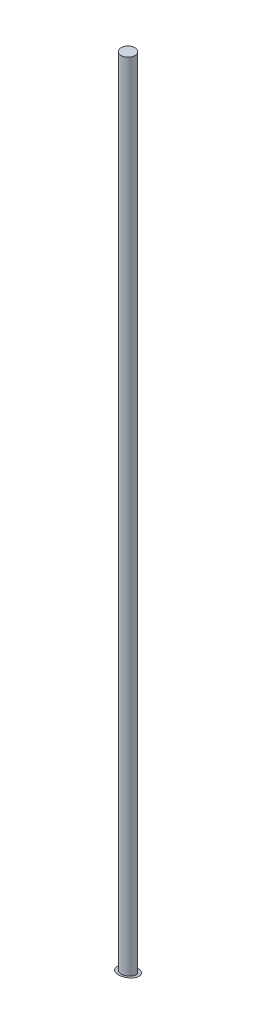
ISO-10303-21;
HEADER;
FILE_DESCRIPTION(('STEP AP214'),'2;1');
FILE_NAME('part.step','',(''),(''),'','','');
FILE_SCHEMA(('AUTOMOTIVE_DESIGN { 1 0 10303 214 1 1 1 1 }'));
ENDSEC;
DATA;
#1=APPLICATION_CONTEXT('core data for automotive mechanical design processes');
#2=APPLICATION_PROTOCOL_DEFINITION('international standard','automotive_design',2000,#1);
#3=PRODUCT_CONTEXT('',#1,'mechanical');
#4=PRODUCT('Part','Part','',(#3));
#5=PRODUCT_RELATED_PRODUCT_CATEGORY('part','',(#4));
#6=PRODUCT_DEFINITION_FORMATION('','',#4);
#7=PRODUCT_DEFINITION_CONTEXT('part definition',#1,'design');
#8=PRODUCT_DEFINITION('design','',#6,#7);
#9=PRODUCT_DEFINITION_SHAPE('','',#8);
#10=(LENGTH_UNIT() NAMED_UNIT(*) SI_UNIT(.MILLI.,.METRE.));
#11=(NAMED_UNIT(*) PLANE_ANGLE_UNIT() SI_UNIT($,.RADIAN.));
#12=(NAMED_UNIT(*) SI_UNIT($,.STERADIAN.) SOLID_ANGLE_UNIT());
#13=UNCERTAINTY_MEASURE_WITH_UNIT(LENGTH_MEASURE(1.E-05),#10,'distance_accuracy_value','');
#14=(GEOMETRIC_REPRESENTATION_CONTEXT(3) GLOBAL_UNCERTAINTY_ASSIGNED_CONTEXT((#13)) GLOBAL_UNIT_ASSIGNED_CONTEXT((#10,
#11,#12)) REPRESENTATION_CONTEXT('',''));
#15=CARTESIAN_POINT('',(0.,0.,0.));
#16=DIRECTION('',(0.,0.,1.));
#17=DIRECTION('',(1.,0.,0.));
#18=AXIS2_PLACEMENT_3D('',#15,#16,#17);
#19=CARTESIAN_POINT('',(0.,145.,0.));
#20=DIRECTION('',(0.,-1.,0.));
#21=DIRECTION('',(0.,0.,-1.));
#22=AXIS2_PLACEMENT_3D('',#19,#20,#21);
#23=CYLINDRICAL_SURFACE('',#22,1.25);
#24=CARTESIAN_POINT('',(0.,0.225135735292148,0.));
#25=DIRECTION('',(0.,-0.984164685861508,0.177256512159977));
#26=DIRECTION('',(0.,-0.177256512159977,-0.984164685861508));
#27=AXIS2_PLACEMENT_3D('',#24,#25,#26);
#28=ELLIPSE('',#27,1.27011263252734,1.25);
#29=CARTESIAN_POINT('',(0.,0.,-1.25));
#30=VERTEX_POINT('',#29);
#31=EDGE_CURVE('E38',#30,#30,#28,.T.);
#32=ORIENTED_EDGE('',*,*,#31,.F.);
#33=EDGE_LOOP('',(#32));
#34=FACE_BOUND('',#33,.T.);
#35=CARTESIAN_POINT('',(0.,145.,0.));
#36=DIRECTION('',(0.,1.,0.));
#37=DIRECTION('',(0.,0.,1.));
#38=AXIS2_PLACEMENT_3D('',#35,#36,#37);
#39=CIRCLE('',#38,1.25);
#40=CARTESIAN_POINT('',(0.,145.,1.25));
#41=VERTEX_POINT('',#40);
#42=EDGE_CURVE('E11',#41,#41,#39,.T.);
#43=ORIENTED_EDGE('',*,*,#42,.F.);
#44=EDGE_LOOP('',(#43));
#45=FACE_BOUND('',#44,.T.);
#46=ADVANCED_FACE('F32',(#34,#45),#23,.T.);
#47=CARTESIAN_POINT('',(0.,145.,0.));
#48=DIRECTION('',(0.,1.,0.));
#49=DIRECTION('',(0.,0.,1.));
#50=AXIS2_PLACEMENT_3D('',#47,#48,#49);
#51=PLANE('',#50);
#52=ORIENTED_EDGE('',*,*,#42,.T.);
#53=EDGE_LOOP('',(#52));
#54=FACE_BOUND('',#53,.T.);
#55=ADVANCED_FACE('F45',(#54),#51,.T.);
#56=CARTESIAN_POINT('',(0.,0.22521957754654,0.000465509475366398));
#57=DIRECTION('',(0.,0.984164685861508,-0.177256512159977));
#58=DIRECTION('',(0.,-0.177256512159977,-0.984164685861508));
#59=AXIS2_PLACEMENT_3D('',#56,#57,#58);
#60=CONICAL_SURFACE('',#59,1.75,1.11701072127637);
#61=CARTESIAN_POINT('',(0.,-0.614796504621554,0.151759620128264));
#62=VERTEX_POINT('',#61);
#63=VERTEX_LOOP('',#62);
#64=FACE_BOUND('',#63,.T.);
#65=CARTESIAN_POINT('',(0.,0.22521957754654,0.000465509475366398));
#66=DIRECTION('',(0.,-0.984164685861508,0.177256512159977));
#67=DIRECTION('',(0.,-0.177256512159977,-0.984164685861508));
#68=AXIS2_PLACEMENT_3D('',#65,#66,#67);
#69=CIRCLE('',#68,1.75);
#70=CARTESIAN_POINT('',(0.,-0.0849793187334196,-1.72182269078227));
#71=VERTEX_POINT('',#70);
#72=EDGE_CURVE('E49',#71,#71,#69,.T.);
#73=ORIENTED_EDGE('',*,*,#72,.T.);
#74=EDGE_LOOP('',(#73));
#75=FACE_BOUND('',#74,.T.);
#76=ADVANCED_FACE('F41',(#64,#75),#60,.T.);
#77=CARTESIAN_POINT('',(0.,0.22521957754654,0.000465509475366398));
#78=DIRECTION('',(0.,-0.984164685861508,0.177256512159977));
#79=DIRECTION('',(0.,-0.177256512159977,-0.984164685861508));
#80=AXIS2_PLACEMENT_3D('',#77,#78,#79);
#81=PLANE('',#80);
#82=ORIENTED_EDGE('',*,*,#31,.T.);
#83=EDGE_LOOP('',(#82));
#84=FACE_BOUND('',#83,.T.);
#85=ORIENTED_EDGE('',*,*,#72,.F.);
#86=EDGE_LOOP('',(#85));
#87=FACE_BOUND('',#86,.T.);
#88=ADVANCED_FACE('F44',(#84,#87),#81,.F.);
#89=CLOSED_SHELL('',(#46,#55,#76,#88));
#90=MANIFOLD_SOLID_BREP('B2',#89);
#91=ADVANCED_BREP_SHAPE_REPRESENTATION('',(#18,#90),#14);
#92=SHAPE_DEFINITION_REPRESENTATION(#9,#91);
ENDSEC;
END-ISO-10303-21;
